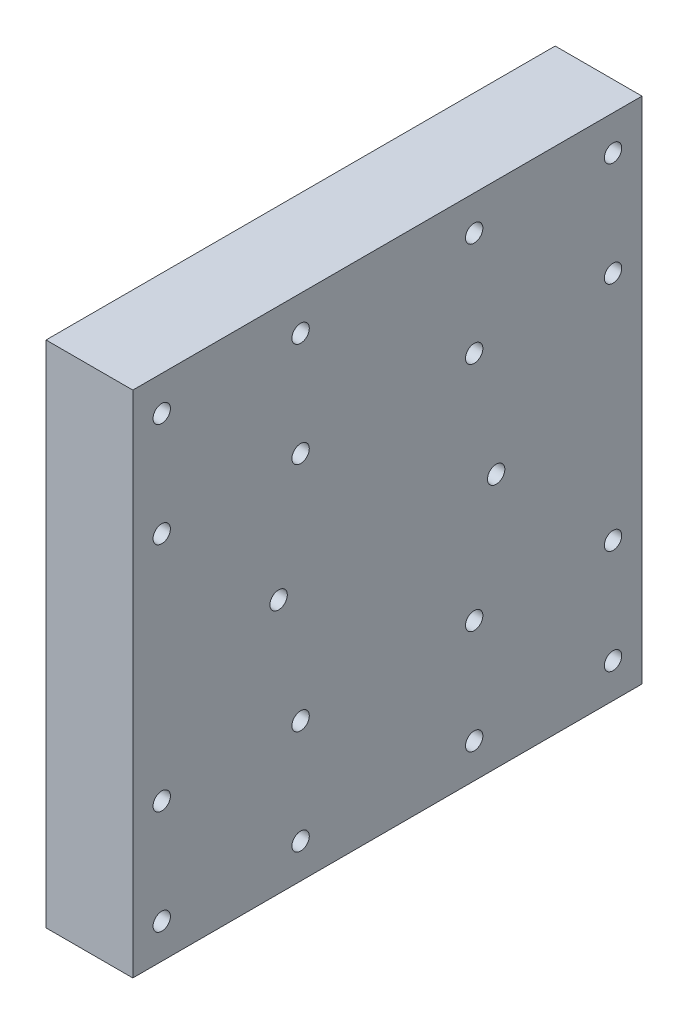
ISO-10303-21;
HEADER;
FILE_DESCRIPTION(('STEP AP214'),'2;1');
FILE_NAME('part.step','',(''),(''),'','','');
FILE_SCHEMA(('AUTOMOTIVE_DESIGN { 1 0 10303 214 1 1 1 1 }'));
ENDSEC;
DATA;
#1=APPLICATION_CONTEXT('core data for automotive mechanical design processes');
#2=APPLICATION_PROTOCOL_DEFINITION('international standard','automotive_design',2000,#1);
#3=PRODUCT_CONTEXT('',#1,'mechanical');
#4=PRODUCT('Part','Part','',(#3));
#5=PRODUCT_RELATED_PRODUCT_CATEGORY('part','',(#4));
#6=PRODUCT_DEFINITION_FORMATION('','',#4);
#7=PRODUCT_DEFINITION_CONTEXT('part definition',#1,'design');
#8=PRODUCT_DEFINITION('design','',#6,#7);
#9=PRODUCT_DEFINITION_SHAPE('','',#8);
#10=(LENGTH_UNIT() NAMED_UNIT(*) SI_UNIT(.MILLI.,.METRE.));
#11=(NAMED_UNIT(*) PLANE_ANGLE_UNIT() SI_UNIT($,.RADIAN.));
#12=(NAMED_UNIT(*) SI_UNIT($,.STERADIAN.) SOLID_ANGLE_UNIT());
#13=UNCERTAINTY_MEASURE_WITH_UNIT(LENGTH_MEASURE(1.E-05),#10,'distance_accuracy_value','');
#14=(GEOMETRIC_REPRESENTATION_CONTEXT(3) GLOBAL_UNCERTAINTY_ASSIGNED_CONTEXT((#13)) GLOBAL_UNIT_ASSIGNED_CONTEXT((#10,
#11,#12)) REPRESENTATION_CONTEXT('',''));
#15=CARTESIAN_POINT('',(0.,0.,0.));
#16=DIRECTION('',(0.,0.,1.));
#17=DIRECTION('',(1.,0.,0.));
#18=AXIS2_PLACEMENT_3D('',#15,#16,#17);
#19=CARTESIAN_POINT('',(15.,0.,0.));
#20=DIRECTION('',(-1.,0.,0.));
#21=DIRECTION('',(0.,0.,1.));
#22=AXIS2_PLACEMENT_3D('',#19,#20,#21);
#23=PLANE('',#22);
#24=CARTESIAN_POINT('',(15.,44.,-25.2));
#25=DIRECTION('',(1.,0.,0.));
#26=DIRECTION('',(0.,0.,-1.));
#27=AXIS2_PLACEMENT_3D('',#24,#25,#26);
#28=CIRCLE('',#27,1.5);
#29=CARTESIAN_POINT('',(15.,44.,-26.7));
#30=VERTEX_POINT('',#29);
#31=EDGE_CURVE('E205',#30,#30,#28,.T.);
#32=ORIENTED_EDGE('',*,*,#31,.F.);
#33=EDGE_LOOP('',(#32));
#34=FACE_BOUND('',#33,.T.);
#35=CARTESIAN_POINT('',(15.,6.00000000000001,-29.));
#36=DIRECTION('',(1.,0.,0.));
#37=DIRECTION('',(0.,0.,1.));
#38=AXIS2_PLACEMENT_3D('',#35,#36,#37);
#39=CIRCLE('',#38,1.5);
#40=CARTESIAN_POINT('',(15.,6.00000000000001,-27.5));
#41=VERTEX_POINT('',#40);
#42=EDGE_CURVE('E193',#41,#41,#39,.T.);
#43=ORIENTED_EDGE('',*,*,#42,.F.);
#44=EDGE_LOOP('',(#43));
#45=FACE_BOUND('',#44,.T.);
#46=CARTESIAN_POINT('',(15.,24.,-29.));
#47=DIRECTION('',(1.,0.,0.));
#48=DIRECTION('',(0.,0.,1.));
#49=AXIS2_PLACEMENT_3D('',#46,#47,#48);
#50=CIRCLE('',#49,1.5);
#51=CARTESIAN_POINT('',(15.,24.,-27.5));
#52=VERTEX_POINT('',#51);
#53=EDGE_CURVE('E181',#52,#52,#50,.T.);
#54=ORIENTED_EDGE('',*,*,#53,.F.);
#55=EDGE_LOOP('',(#54));
#56=FACE_BOUND('',#55,.T.);
#57=CARTESIAN_POINT('',(15.,6.00000000000001,-83.));
#58=DIRECTION('',(1.,0.,0.));
#59=DIRECTION('',(0.,0.,-1.));
#60=AXIS2_PLACEMENT_3D('',#57,#58,#59);
#61=CIRCLE('',#60,1.50000000000001);
#62=CARTESIAN_POINT('',(15.,6.00000000000001,-84.5));
#63=VERTEX_POINT('',#62);
#64=EDGE_CURVE('E169',#63,#63,#61,.T.);
#65=ORIENTED_EDGE('',*,*,#64,.F.);
#66=EDGE_LOOP('',(#65));
#67=FACE_BOUND('',#66,.T.);
#68=CARTESIAN_POINT('',(15.,24.,-83.));
#69=DIRECTION('',(1.,0.,0.));
#70=DIRECTION('',(0.,0.,-1.));
#71=AXIS2_PLACEMENT_3D('',#68,#69,#70);
#72=CIRCLE('',#71,1.50000000000001);
#73=CARTESIAN_POINT('',(15.,24.,-84.5));
#74=VERTEX_POINT('',#73);
#75=EDGE_CURVE('E157',#74,#74,#72,.T.);
#76=ORIENTED_EDGE('',*,*,#75,.F.);
#77=EDGE_LOOP('',(#76));
#78=FACE_BOUND('',#77,.T.);
#79=CARTESIAN_POINT('',(15.,64.,-83.));
#80=DIRECTION('',(1.,0.,0.));
#81=DIRECTION('',(0.,0.,1.));
#82=AXIS2_PLACEMENT_3D('',#79,#80,#81);
#83=CIRCLE('',#82,1.50000000000001);
#84=CARTESIAN_POINT('',(15.,64.,-81.5));
#85=VERTEX_POINT('',#84);
#86=EDGE_CURVE('E145',#85,#85,#83,.T.);
#87=ORIENTED_EDGE('',*,*,#86,.F.);
#88=EDGE_LOOP('',(#87));
#89=FACE_BOUND('',#88,.T.);
#90=CARTESIAN_POINT('',(15.,64.,-59.));
#91=DIRECTION('',(1.,0.,0.));
#92=DIRECTION('',(0.,0.,1.));
#93=AXIS2_PLACEMENT_3D('',#90,#91,#92);
#94=CIRCLE('',#93,1.5);
#95=CARTESIAN_POINT('',(15.,64.,-57.5));
#96=VERTEX_POINT('',#95);
#97=EDGE_CURVE('E133',#96,#96,#94,.T.);
#98=ORIENTED_EDGE('',*,*,#97,.F.);
#99=EDGE_LOOP('',(#98));
#100=FACE_BOUND('',#99,.T.);
#101=CARTESIAN_POINT('',(15.,64.,-29.));
#102=DIRECTION('',(1.,0.,0.));
#103=DIRECTION('',(0.,0.,-1.));
#104=AXIS2_PLACEMENT_3D('',#101,#102,#103);
#105=CIRCLE('',#104,1.5);
#106=CARTESIAN_POINT('',(15.,64.,-30.5));
#107=VERTEX_POINT('',#106);
#108=EDGE_CURVE('E121',#107,#107,#105,.T.);
#109=ORIENTED_EDGE('',*,*,#108,.F.);
#110=EDGE_LOOP('',(#109));
#111=FACE_BOUND('',#110,.T.);
#112=CARTESIAN_POINT('',(15.,82.,-5.));
#113=DIRECTION('',(1.,0.,0.));
#114=DIRECTION('',(0.,0.,-1.));
#115=AXIS2_PLACEMENT_3D('',#112,#113,#114);
#116=CIRCLE('',#115,1.5);
#117=CARTESIAN_POINT('',(15.,82.,-6.5));
#118=VERTEX_POINT('',#117);
#119=EDGE_CURVE('E100',#118,#118,#116,.T.);
#120=ORIENTED_EDGE('',*,*,#119,.F.);
#121=EDGE_LOOP('',(#120));
#122=FACE_BOUND('',#121,.T.);
#123=DIRECTION('',(0.,-1.,0.));
#124=VECTOR('',#123,1.);
#125=CARTESIAN_POINT('',(15.,0.,0.));
#126=LINE('',#125,#124);
#127=CARTESIAN_POINT('',(15.,88.,0.));
#128=VERTEX_POINT('',#127);
#129=CARTESIAN_POINT('',(15.,0.,0.));
#130=VERTEX_POINT('',#129);
#131=EDGE_CURVE('E85',#128,#130,#126,.T.);
#132=ORIENTED_EDGE('',*,*,#131,.T.);
#133=DIRECTION('',(0.,0.,-1.));
#134=VECTOR('',#133,1.);
#135=CARTESIAN_POINT('',(15.,0.,0.));
#136=LINE('',#135,#134);
#137=CARTESIAN_POINT('',(15.,0.,-88.));
#138=VERTEX_POINT('',#137);
#139=EDGE_CURVE('E80',#130,#138,#136,.T.);
#140=ORIENTED_EDGE('',*,*,#139,.T.);
#141=DIRECTION('',(0.,1.,0.));
#142=VECTOR('',#141,1.);
#143=CARTESIAN_POINT('',(15.,0.,-88.));
#144=LINE('',#143,#142);
#145=CARTESIAN_POINT('',(15.,88.,-88.));
#146=VERTEX_POINT('',#145);
#147=EDGE_CURVE('E83',#138,#146,#144,.T.);
#148=ORIENTED_EDGE('',*,*,#147,.T.);
#149=DIRECTION('',(0.,0.,1.));
#150=VECTOR('',#149,1.);
#151=CARTESIAN_POINT('',(15.,88.,0.));
#152=LINE('',#151,#150);
#153=EDGE_CURVE('E50',#146,#128,#152,.T.);
#154=ORIENTED_EDGE('',*,*,#153,.T.);
#155=EDGE_LOOP('',(#132,#140,#148,#154));
#156=FACE_BOUND('',#155,.T.);
#157=CARTESIAN_POINT('',(15.,82.,-29.));
#158=DIRECTION('',(1.,0.,0.));
#159=DIRECTION('',(0.,0.,-1.));
#160=AXIS2_PLACEMENT_3D('',#157,#158,#159);
#161=CIRCLE('',#160,1.5);
#162=CARTESIAN_POINT('',(15.,82.,-30.5));
#163=VERTEX_POINT('',#162);
#164=EDGE_CURVE('E115',#163,#163,#161,.T.);
#165=ORIENTED_EDGE('',*,*,#164,.F.);
#166=EDGE_LOOP('',(#165));
#167=FACE_BOUND('',#166,.T.);
#168=CARTESIAN_POINT('',(15.,64.,-5.));
#169=DIRECTION('',(1.,0.,0.));
#170=DIRECTION('',(0.,0.,-1.));
#171=AXIS2_PLACEMENT_3D('',#168,#169,#170);
#172=CIRCLE('',#171,1.5);
#173=CARTESIAN_POINT('',(15.,64.,-6.5));
#174=VERTEX_POINT('',#173);
#175=EDGE_CURVE('E127',#174,#174,#172,.T.);
#176=ORIENTED_EDGE('',*,*,#175,.F.);
#177=EDGE_LOOP('',(#176));
#178=FACE_BOUND('',#177,.T.);
#179=CARTESIAN_POINT('',(15.,82.,-59.));
#180=DIRECTION('',(1.,0.,0.));
#181=DIRECTION('',(0.,0.,1.));
#182=AXIS2_PLACEMENT_3D('',#179,#180,#181);
#183=CIRCLE('',#182,1.5);
#184=CARTESIAN_POINT('',(15.,82.,-57.5));
#185=VERTEX_POINT('',#184);
#186=EDGE_CURVE('E139',#185,#185,#183,.T.);
#187=ORIENTED_EDGE('',*,*,#186,.F.);
#188=EDGE_LOOP('',(#187));
#189=FACE_BOUND('',#188,.T.);
#190=CARTESIAN_POINT('',(15.,82.,-83.));
#191=DIRECTION('',(1.,0.,0.));
#192=DIRECTION('',(0.,0.,1.));
#193=AXIS2_PLACEMENT_3D('',#190,#191,#192);
#194=CIRCLE('',#193,1.50000000000001);
#195=CARTESIAN_POINT('',(15.,82.,-81.5));
#196=VERTEX_POINT('',#195);
#197=EDGE_CURVE('E151',#196,#196,#194,.T.);
#198=ORIENTED_EDGE('',*,*,#197,.F.);
#199=EDGE_LOOP('',(#198));
#200=FACE_BOUND('',#199,.T.);
#201=CARTESIAN_POINT('',(15.,24.,-59.));
#202=DIRECTION('',(1.,0.,0.));
#203=DIRECTION('',(0.,0.,-1.));
#204=AXIS2_PLACEMENT_3D('',#201,#202,#203);
#205=CIRCLE('',#204,1.5);
#206=CARTESIAN_POINT('',(15.,24.,-60.5));
#207=VERTEX_POINT('',#206);
#208=EDGE_CURVE('E163',#207,#207,#205,.T.);
#209=ORIENTED_EDGE('',*,*,#208,.F.);
#210=EDGE_LOOP('',(#209));
#211=FACE_BOUND('',#210,.T.);
#212=CARTESIAN_POINT('',(15.,6.00000000000001,-59.));
#213=DIRECTION('',(1.,0.,0.));
#214=DIRECTION('',(0.,0.,-1.));
#215=AXIS2_PLACEMENT_3D('',#212,#213,#214);
#216=CIRCLE('',#215,1.5);
#217=CARTESIAN_POINT('',(15.,6.00000000000001,-60.5));
#218=VERTEX_POINT('',#217);
#219=EDGE_CURVE('E175',#218,#218,#216,.T.);
#220=ORIENTED_EDGE('',*,*,#219,.F.);
#221=EDGE_LOOP('',(#220));
#222=FACE_BOUND('',#221,.T.);
#223=CARTESIAN_POINT('',(15.,24.,-5.));
#224=DIRECTION('',(1.,0.,0.));
#225=DIRECTION('',(0.,0.,1.));
#226=AXIS2_PLACEMENT_3D('',#223,#224,#225);
#227=CIRCLE('',#226,1.5);
#228=CARTESIAN_POINT('',(15.,24.,-3.5));
#229=VERTEX_POINT('',#228);
#230=EDGE_CURVE('E187',#229,#229,#227,.T.);
#231=ORIENTED_EDGE('',*,*,#230,.F.);
#232=EDGE_LOOP('',(#231));
#233=FACE_BOUND('',#232,.T.);
#234=CARTESIAN_POINT('',(15.,6.00000000000001,-5.));
#235=DIRECTION('',(1.,0.,0.));
#236=DIRECTION('',(0.,0.,1.));
#237=AXIS2_PLACEMENT_3D('',#234,#235,#236);
#238=CIRCLE('',#237,1.5);
#239=CARTESIAN_POINT('',(15.,6.00000000000001,-3.5));
#240=VERTEX_POINT('',#239);
#241=EDGE_CURVE('E199',#240,#240,#238,.T.);
#242=ORIENTED_EDGE('',*,*,#241,.F.);
#243=EDGE_LOOP('',(#242));
#244=FACE_BOUND('',#243,.T.);
#245=CARTESIAN_POINT('',(15.,44.,-62.8));
#246=DIRECTION('',(1.,0.,0.));
#247=DIRECTION('',(0.,0.,-1.));
#248=AXIS2_PLACEMENT_3D('',#245,#246,#247);
#249=CIRCLE('',#248,1.5);
#250=CARTESIAN_POINT('',(15.,44.,-64.3));
#251=VERTEX_POINT('',#250);
#252=EDGE_CURVE('E211',#251,#251,#249,.T.);
#253=ORIENTED_EDGE('',*,*,#252,.F.);
#254=EDGE_LOOP('',(#253));
#255=FACE_BOUND('',#254,.T.);
#256=ADVANCED_FACE('F33',(#34,#45,#56,#67,#78,#89,#100,#111,#122,#156,#167,#178,#189,#200,#211,
#222,#233,#244,#255),#23,.F.);
#257=CARTESIAN_POINT('',(0.,0.,0.));
#258=DIRECTION('',(-1.,0.,0.));
#259=DIRECTION('',(0.,0.,1.));
#260=AXIS2_PLACEMENT_3D('',#257,#258,#259);
#261=PLANE('',#260);
#262=CARTESIAN_POINT('',(0.,44.,-25.2));
#263=DIRECTION('',(1.,0.,0.));
#264=DIRECTION('',(0.,0.,-1.));
#265=AXIS2_PLACEMENT_3D('',#262,#263,#264);
#266=CIRCLE('',#265,1.5);
#267=CARTESIAN_POINT('',(0.,44.,-26.7));
#268=VERTEX_POINT('',#267);
#269=EDGE_CURVE('E208',#268,#268,#266,.T.);
#270=ORIENTED_EDGE('',*,*,#269,.T.);
#271=EDGE_LOOP('',(#270));
#272=FACE_BOUND('',#271,.T.);
#273=CARTESIAN_POINT('',(0.,6.00000000000001,-29.));
#274=DIRECTION('',(1.,0.,0.));
#275=DIRECTION('',(0.,0.,1.));
#276=AXIS2_PLACEMENT_3D('',#273,#274,#275);
#277=CIRCLE('',#276,1.5);
#278=CARTESIAN_POINT('',(0.,6.00000000000001,-27.5));
#279=VERTEX_POINT('',#278);
#280=EDGE_CURVE('E196',#279,#279,#277,.T.);
#281=ORIENTED_EDGE('',*,*,#280,.T.);
#282=EDGE_LOOP('',(#281));
#283=FACE_BOUND('',#282,.T.);
#284=CARTESIAN_POINT('',(0.,24.,-29.));
#285=DIRECTION('',(1.,0.,0.));
#286=DIRECTION('',(0.,0.,1.));
#287=AXIS2_PLACEMENT_3D('',#284,#285,#286);
#288=CIRCLE('',#287,1.5);
#289=CARTESIAN_POINT('',(0.,24.,-27.5));
#290=VERTEX_POINT('',#289);
#291=EDGE_CURVE('E184',#290,#290,#288,.T.);
#292=ORIENTED_EDGE('',*,*,#291,.T.);
#293=EDGE_LOOP('',(#292));
#294=FACE_BOUND('',#293,.T.);
#295=CARTESIAN_POINT('',(0.,6.00000000000001,-83.));
#296=DIRECTION('',(1.,0.,0.));
#297=DIRECTION('',(0.,0.,-1.));
#298=AXIS2_PLACEMENT_3D('',#295,#296,#297);
#299=CIRCLE('',#298,1.50000000000001);
#300=CARTESIAN_POINT('',(0.,6.00000000000001,-84.5));
#301=VERTEX_POINT('',#300);
#302=EDGE_CURVE('E172',#301,#301,#299,.T.);
#303=ORIENTED_EDGE('',*,*,#302,.T.);
#304=EDGE_LOOP('',(#303));
#305=FACE_BOUND('',#304,.T.);
#306=CARTESIAN_POINT('',(0.,24.,-83.));
#307=DIRECTION('',(1.,0.,0.));
#308=DIRECTION('',(0.,0.,-1.));
#309=AXIS2_PLACEMENT_3D('',#306,#307,#308);
#310=CIRCLE('',#309,1.50000000000001);
#311=CARTESIAN_POINT('',(0.,24.,-84.5));
#312=VERTEX_POINT('',#311);
#313=EDGE_CURVE('E160',#312,#312,#310,.T.);
#314=ORIENTED_EDGE('',*,*,#313,.T.);
#315=EDGE_LOOP('',(#314));
#316=FACE_BOUND('',#315,.T.);
#317=CARTESIAN_POINT('',(0.,64.,-83.));
#318=DIRECTION('',(1.,0.,0.));
#319=DIRECTION('',(0.,0.,1.));
#320=AXIS2_PLACEMENT_3D('',#317,#318,#319);
#321=CIRCLE('',#320,1.50000000000001);
#322=CARTESIAN_POINT('',(0.,64.,-81.5));
#323=VERTEX_POINT('',#322);
#324=EDGE_CURVE('E148',#323,#323,#321,.T.);
#325=ORIENTED_EDGE('',*,*,#324,.T.);
#326=EDGE_LOOP('',(#325));
#327=FACE_BOUND('',#326,.T.);
#328=CARTESIAN_POINT('',(0.,64.,-59.));
#329=DIRECTION('',(1.,0.,0.));
#330=DIRECTION('',(0.,0.,1.));
#331=AXIS2_PLACEMENT_3D('',#328,#329,#330);
#332=CIRCLE('',#331,1.5);
#333=CARTESIAN_POINT('',(0.,64.,-57.5));
#334=VERTEX_POINT('',#333);
#335=EDGE_CURVE('E136',#334,#334,#332,.T.);
#336=ORIENTED_EDGE('',*,*,#335,.T.);
#337=EDGE_LOOP('',(#336));
#338=FACE_BOUND('',#337,.T.);
#339=CARTESIAN_POINT('',(0.,64.,-29.));
#340=DIRECTION('',(1.,0.,0.));
#341=DIRECTION('',(0.,0.,-1.));
#342=AXIS2_PLACEMENT_3D('',#339,#340,#341);
#343=CIRCLE('',#342,1.5);
#344=CARTESIAN_POINT('',(0.,64.,-30.5));
#345=VERTEX_POINT('',#344);
#346=EDGE_CURVE('E124',#345,#345,#343,.T.);
#347=ORIENTED_EDGE('',*,*,#346,.T.);
#348=EDGE_LOOP('',(#347));
#349=FACE_BOUND('',#348,.T.);
#350=CARTESIAN_POINT('',(0.,82.,-5.));
#351=DIRECTION('',(1.,0.,0.));
#352=DIRECTION('',(0.,0.,-1.));
#353=AXIS2_PLACEMENT_3D('',#350,#351,#352);
#354=CIRCLE('',#353,1.5);
#355=CARTESIAN_POINT('',(0.,82.,-6.5));
#356=VERTEX_POINT('',#355);
#357=EDGE_CURVE('E112',#356,#356,#354,.T.);
#358=ORIENTED_EDGE('',*,*,#357,.T.);
#359=EDGE_LOOP('',(#358));
#360=FACE_BOUND('',#359,.T.);
#361=DIRECTION('',(0.,-1.,0.));
#362=VECTOR('',#361,1.);
#363=CARTESIAN_POINT('',(0.,0.,0.));
#364=LINE('',#363,#362);
#365=CARTESIAN_POINT('',(0.,88.,0.));
#366=VERTEX_POINT('',#365);
#367=CARTESIAN_POINT('',(0.,0.,0.));
#368=VERTEX_POINT('',#367);
#369=EDGE_CURVE('E97',#366,#368,#364,.T.);
#370=ORIENTED_EDGE('',*,*,#369,.F.);
#371=DIRECTION('',(0.,0.,1.));
#372=VECTOR('',#371,1.);
#373=CARTESIAN_POINT('',(0.,88.,0.));
#374=LINE('',#373,#372);
#375=CARTESIAN_POINT('',(0.,88.,-88.));
#376=VERTEX_POINT('',#375);
#377=EDGE_CURVE('E73',#376,#366,#374,.T.);
#378=ORIENTED_EDGE('',*,*,#377,.F.);
#379=DIRECTION('',(0.,1.,0.));
#380=VECTOR('',#379,1.);
#381=CARTESIAN_POINT('',(0.,0.,-88.));
#382=LINE('',#381,#380);
#383=CARTESIAN_POINT('',(0.,0.,-88.));
#384=VERTEX_POINT('',#383);
#385=EDGE_CURVE('E67',#384,#376,#382,.T.);
#386=ORIENTED_EDGE('',*,*,#385,.F.);
#387=DIRECTION('',(0.,0.,-1.));
#388=VECTOR('',#387,1.);
#389=CARTESIAN_POINT('',(0.,0.,0.));
#390=LINE('',#389,#388);
#391=EDGE_CURVE('E89',#368,#384,#390,.T.);
#392=ORIENTED_EDGE('',*,*,#391,.F.);
#393=EDGE_LOOP('',(#370,#378,#386,#392));
#394=FACE_BOUND('',#393,.T.);
#395=CARTESIAN_POINT('',(0.,82.,-29.));
#396=DIRECTION('',(1.,0.,0.));
#397=DIRECTION('',(0.,0.,-1.));
#398=AXIS2_PLACEMENT_3D('',#395,#396,#397);
#399=CIRCLE('',#398,1.5);
#400=CARTESIAN_POINT('',(0.,82.,-30.5));
#401=VERTEX_POINT('',#400);
#402=EDGE_CURVE('E118',#401,#401,#399,.T.);
#403=ORIENTED_EDGE('',*,*,#402,.T.);
#404=EDGE_LOOP('',(#403));
#405=FACE_BOUND('',#404,.T.);
#406=CARTESIAN_POINT('',(0.,64.,-5.));
#407=DIRECTION('',(1.,0.,0.));
#408=DIRECTION('',(0.,0.,-1.));
#409=AXIS2_PLACEMENT_3D('',#406,#407,#408);
#410=CIRCLE('',#409,1.5);
#411=CARTESIAN_POINT('',(0.,64.,-6.5));
#412=VERTEX_POINT('',#411);
#413=EDGE_CURVE('E130',#412,#412,#410,.T.);
#414=ORIENTED_EDGE('',*,*,#413,.T.);
#415=EDGE_LOOP('',(#414));
#416=FACE_BOUND('',#415,.T.);
#417=CARTESIAN_POINT('',(0.,82.,-59.));
#418=DIRECTION('',(1.,0.,0.));
#419=DIRECTION('',(0.,0.,1.));
#420=AXIS2_PLACEMENT_3D('',#417,#418,#419);
#421=CIRCLE('',#420,1.5);
#422=CARTESIAN_POINT('',(0.,82.,-57.5));
#423=VERTEX_POINT('',#422);
#424=EDGE_CURVE('E142',#423,#423,#421,.T.);
#425=ORIENTED_EDGE('',*,*,#424,.T.);
#426=EDGE_LOOP('',(#425));
#427=FACE_BOUND('',#426,.T.);
#428=CARTESIAN_POINT('',(0.,82.,-83.));
#429=DIRECTION('',(1.,0.,0.));
#430=DIRECTION('',(0.,0.,1.));
#431=AXIS2_PLACEMENT_3D('',#428,#429,#430);
#432=CIRCLE('',#431,1.50000000000001);
#433=CARTESIAN_POINT('',(0.,82.,-81.5));
#434=VERTEX_POINT('',#433);
#435=EDGE_CURVE('E154',#434,#434,#432,.T.);
#436=ORIENTED_EDGE('',*,*,#435,.T.);
#437=EDGE_LOOP('',(#436));
#438=FACE_BOUND('',#437,.T.);
#439=CARTESIAN_POINT('',(0.,24.,-59.));
#440=DIRECTION('',(1.,0.,0.));
#441=DIRECTION('',(0.,0.,-1.));
#442=AXIS2_PLACEMENT_3D('',#439,#440,#441);
#443=CIRCLE('',#442,1.5);
#444=CARTESIAN_POINT('',(0.,24.,-60.5));
#445=VERTEX_POINT('',#444);
#446=EDGE_CURVE('E166',#445,#445,#443,.T.);
#447=ORIENTED_EDGE('',*,*,#446,.T.);
#448=EDGE_LOOP('',(#447));
#449=FACE_BOUND('',#448,.T.);
#450=CARTESIAN_POINT('',(0.,6.00000000000001,-59.));
#451=DIRECTION('',(1.,0.,0.));
#452=DIRECTION('',(0.,0.,-1.));
#453=AXIS2_PLACEMENT_3D('',#450,#451,#452);
#454=CIRCLE('',#453,1.5);
#455=CARTESIAN_POINT('',(0.,6.00000000000001,-60.5));
#456=VERTEX_POINT('',#455);
#457=EDGE_CURVE('E178',#456,#456,#454,.T.);
#458=ORIENTED_EDGE('',*,*,#457,.T.);
#459=EDGE_LOOP('',(#458));
#460=FACE_BOUND('',#459,.T.);
#461=CARTESIAN_POINT('',(0.,24.,-5.));
#462=DIRECTION('',(1.,0.,0.));
#463=DIRECTION('',(0.,0.,1.));
#464=AXIS2_PLACEMENT_3D('',#461,#462,#463);
#465=CIRCLE('',#464,1.5);
#466=CARTESIAN_POINT('',(0.,24.,-3.5));
#467=VERTEX_POINT('',#466);
#468=EDGE_CURVE('E190',#467,#467,#465,.T.);
#469=ORIENTED_EDGE('',*,*,#468,.T.);
#470=EDGE_LOOP('',(#469));
#471=FACE_BOUND('',#470,.T.);
#472=CARTESIAN_POINT('',(0.,6.00000000000001,-5.));
#473=DIRECTION('',(1.,0.,0.));
#474=DIRECTION('',(0.,0.,1.));
#475=AXIS2_PLACEMENT_3D('',#472,#473,#474);
#476=CIRCLE('',#475,1.5);
#477=CARTESIAN_POINT('',(0.,6.00000000000001,-3.5));
#478=VERTEX_POINT('',#477);
#479=EDGE_CURVE('E202',#478,#478,#476,.T.);
#480=ORIENTED_EDGE('',*,*,#479,.T.);
#481=EDGE_LOOP('',(#480));
#482=FACE_BOUND('',#481,.T.);
#483=CARTESIAN_POINT('',(0.,44.,-62.8));
#484=DIRECTION('',(1.,0.,0.));
#485=DIRECTION('',(0.,0.,-1.));
#486=AXIS2_PLACEMENT_3D('',#483,#484,#485);
#487=CIRCLE('',#486,1.5);
#488=CARTESIAN_POINT('',(0.,44.,-64.3));
#489=VERTEX_POINT('',#488);
#490=EDGE_CURVE('E214',#489,#489,#487,.T.);
#491=ORIENTED_EDGE('',*,*,#490,.T.);
#492=EDGE_LOOP('',(#491));
#493=FACE_BOUND('',#492,.T.);
#494=ADVANCED_FACE('F108',(#272,#283,#294,#305,#316,#327,#338,#349,#360,#394,#405,#416,#427,
#438,#449,#460,#471,#482,#493),#261,.T.);
#495=CARTESIAN_POINT('',(15.,0.,0.));
#496=DIRECTION('',(0.,0.,-1.));
#497=DIRECTION('',(-1.,0.,0.));
#498=AXIS2_PLACEMENT_3D('',#495,#496,#497);
#499=PLANE('',#498);
#500=ORIENTED_EDGE('',*,*,#369,.T.);
#501=DIRECTION('',(-1.,0.,0.));
#502=VECTOR('',#501,1.);
#503=CARTESIAN_POINT('',(15.,0.,0.));
#504=LINE('',#503,#502);
#505=EDGE_CURVE('E11',#130,#368,#504,.T.);
#506=ORIENTED_EDGE('',*,*,#505,.F.);
#507=ORIENTED_EDGE('',*,*,#131,.F.);
#508=DIRECTION('',(-1.,0.,0.));
#509=VECTOR('',#508,1.);
#510=CARTESIAN_POINT('',(15.,88.,0.));
#511=LINE('',#510,#509);
#512=EDGE_CURVE('E93',#128,#366,#511,.T.);
#513=ORIENTED_EDGE('',*,*,#512,.T.);
#514=EDGE_LOOP('',(#500,#506,#507,#513));
#515=FACE_BOUND('',#514,.T.);
#516=ADVANCED_FACE('F35',(#515),#499,.F.);
#517=CARTESIAN_POINT('',(15.,0.,0.));
#518=DIRECTION('',(0.,1.,0.));
#519=DIRECTION('',(0.,0.,1.));
#520=AXIS2_PLACEMENT_3D('',#517,#518,#519);
#521=PLANE('',#520);
#522=ORIENTED_EDGE('',*,*,#391,.T.);
#523=DIRECTION('',(-1.,0.,0.));
#524=VECTOR('',#523,1.);
#525=CARTESIAN_POINT('',(15.,0.,-88.));
#526=LINE('',#525,#524);
#527=EDGE_CURVE('E42',#138,#384,#526,.T.);
#528=ORIENTED_EDGE('',*,*,#527,.F.);
#529=ORIENTED_EDGE('',*,*,#139,.F.);
#530=ORIENTED_EDGE('',*,*,#505,.T.);
#531=EDGE_LOOP('',(#522,#528,#529,#530));
#532=FACE_BOUND('',#531,.T.);
#533=ADVANCED_FACE('F88',(#532),#521,.F.);
#534=CARTESIAN_POINT('',(15.,0.,-88.));
#535=DIRECTION('',(0.,0.,1.));
#536=DIRECTION('',(1.,0.,0.));
#537=AXIS2_PLACEMENT_3D('',#534,#535,#536);
#538=PLANE('',#537);
#539=ORIENTED_EDGE('',*,*,#385,.T.);
#540=DIRECTION('',(-1.,0.,0.));
#541=VECTOR('',#540,1.);
#542=CARTESIAN_POINT('',(15.,88.,-88.));
#543=LINE('',#542,#541);
#544=EDGE_CURVE('E90',#146,#376,#543,.T.);
#545=ORIENTED_EDGE('',*,*,#544,.F.);
#546=ORIENTED_EDGE('',*,*,#147,.F.);
#547=ORIENTED_EDGE('',*,*,#527,.T.);
#548=EDGE_LOOP('',(#539,#545,#546,#547));
#549=FACE_BOUND('',#548,.T.);
#550=ADVANCED_FACE('F91',(#549),#538,.F.);
#551=CARTESIAN_POINT('',(15.,88.,0.));
#552=DIRECTION('',(0.,-1.,0.));
#553=DIRECTION('',(0.,0.,-1.));
#554=AXIS2_PLACEMENT_3D('',#551,#552,#553);
#555=PLANE('',#554);
#556=ORIENTED_EDGE('',*,*,#377,.T.);
#557=ORIENTED_EDGE('',*,*,#512,.F.);
#558=ORIENTED_EDGE('',*,*,#153,.F.);
#559=ORIENTED_EDGE('',*,*,#544,.T.);
#560=EDGE_LOOP('',(#556,#557,#558,#559));
#561=FACE_BOUND('',#560,.T.);
#562=ADVANCED_FACE('F105',(#561),#555,.F.);
#563=CARTESIAN_POINT('',(15.,82.,-5.));
#564=DIRECTION('',(-1.,0.,0.));
#565=DIRECTION('',(0.,0.,1.));
#566=AXIS2_PLACEMENT_3D('',#563,#564,#565);
#567=CYLINDRICAL_SURFACE('',#566,1.5);
#568=ORIENTED_EDGE('',*,*,#119,.T.);
#569=EDGE_LOOP('',(#568));
#570=FACE_BOUND('',#569,.T.);
#571=ORIENTED_EDGE('',*,*,#357,.F.);
#572=EDGE_LOOP('',(#571));
#573=FACE_BOUND('',#572,.T.);
#574=ADVANCED_FACE('F234',(#570,#573),#567,.F.);
#575=CARTESIAN_POINT('',(15.,82.,-29.));
#576=DIRECTION('',(-1.,0.,0.));
#577=DIRECTION('',(0.,0.,1.));
#578=AXIS2_PLACEMENT_3D('',#575,#576,#577);
#579=CYLINDRICAL_SURFACE('',#578,1.5);
#580=ORIENTED_EDGE('',*,*,#164,.T.);
#581=EDGE_LOOP('',(#580));
#582=FACE_BOUND('',#581,.T.);
#583=ORIENTED_EDGE('',*,*,#402,.F.);
#584=EDGE_LOOP('',(#583));
#585=FACE_BOUND('',#584,.T.);
#586=ADVANCED_FACE('F280',(#582,#585),#579,.F.);
#587=CARTESIAN_POINT('',(15.,64.,-29.));
#588=DIRECTION('',(-1.,0.,0.));
#589=DIRECTION('',(0.,0.,1.));
#590=AXIS2_PLACEMENT_3D('',#587,#588,#589);
#591=CYLINDRICAL_SURFACE('',#590,1.5);
#592=ORIENTED_EDGE('',*,*,#108,.T.);
#593=EDGE_LOOP('',(#592));
#594=FACE_BOUND('',#593,.T.);
#595=ORIENTED_EDGE('',*,*,#346,.F.);
#596=EDGE_LOOP('',(#595));
#597=FACE_BOUND('',#596,.T.);
#598=ADVANCED_FACE('F288',(#594,#597),#591,.F.);
#599=CARTESIAN_POINT('',(15.,64.,-5.));
#600=DIRECTION('',(-1.,0.,0.));
#601=DIRECTION('',(0.,0.,1.));
#602=AXIS2_PLACEMENT_3D('',#599,#600,#601);
#603=CYLINDRICAL_SURFACE('',#602,1.5);
#604=ORIENTED_EDGE('',*,*,#175,.T.);
#605=EDGE_LOOP('',(#604));
#606=FACE_BOUND('',#605,.T.);
#607=ORIENTED_EDGE('',*,*,#413,.F.);
#608=EDGE_LOOP('',(#607));
#609=FACE_BOUND('',#608,.T.);
#610=ADVANCED_FACE('F296',(#606,#609),#603,.F.);
#611=CARTESIAN_POINT('',(15.,64.,-59.));
#612=DIRECTION('',(-1.,0.,0.));
#613=DIRECTION('',(0.,0.,1.));
#614=AXIS2_PLACEMENT_3D('',#611,#612,#613);
#615=CYLINDRICAL_SURFACE('',#614,1.5);
#616=ORIENTED_EDGE('',*,*,#97,.T.);
#617=EDGE_LOOP('',(#616));
#618=FACE_BOUND('',#617,.T.);
#619=ORIENTED_EDGE('',*,*,#335,.F.);
#620=EDGE_LOOP('',(#619));
#621=FACE_BOUND('',#620,.T.);
#622=ADVANCED_FACE('F305',(#618,#621),#615,.F.);
#623=CARTESIAN_POINT('',(15.,82.,-59.));
#624=DIRECTION('',(-1.,0.,0.));
#625=DIRECTION('',(0.,0.,1.));
#626=AXIS2_PLACEMENT_3D('',#623,#624,#625);
#627=CYLINDRICAL_SURFACE('',#626,1.5);
#628=ORIENTED_EDGE('',*,*,#186,.T.);
#629=EDGE_LOOP('',(#628));
#630=FACE_BOUND('',#629,.T.);
#631=ORIENTED_EDGE('',*,*,#424,.F.);
#632=EDGE_LOOP('',(#631));
#633=FACE_BOUND('',#632,.T.);
#634=ADVANCED_FACE('F314',(#630,#633),#627,.F.);
#635=CARTESIAN_POINT('',(15.,64.,-83.));
#636=DIRECTION('',(-1.,0.,0.));
#637=DIRECTION('',(0.,0.,1.));
#638=AXIS2_PLACEMENT_3D('',#635,#636,#637);
#639=CYLINDRICAL_SURFACE('',#638,1.50000000000001);
#640=ORIENTED_EDGE('',*,*,#86,.T.);
#641=EDGE_LOOP('',(#640));
#642=FACE_BOUND('',#641,.T.);
#643=ORIENTED_EDGE('',*,*,#324,.F.);
#644=EDGE_LOOP('',(#643));
#645=FACE_BOUND('',#644,.T.);
#646=ADVANCED_FACE('F323',(#642,#645),#639,.F.);
#647=CARTESIAN_POINT('',(15.,82.,-83.));
#648=DIRECTION('',(-1.,0.,0.));
#649=DIRECTION('',(0.,0.,1.));
#650=AXIS2_PLACEMENT_3D('',#647,#648,#649);
#651=CYLINDRICAL_SURFACE('',#650,1.50000000000001);
#652=ORIENTED_EDGE('',*,*,#197,.T.);
#653=EDGE_LOOP('',(#652));
#654=FACE_BOUND('',#653,.T.);
#655=ORIENTED_EDGE('',*,*,#435,.F.);
#656=EDGE_LOOP('',(#655));
#657=FACE_BOUND('',#656,.T.);
#658=ADVANCED_FACE('F332',(#654,#657),#651,.F.);
#659=CARTESIAN_POINT('',(15.,24.,-83.));
#660=DIRECTION('',(-1.,0.,0.));
#661=DIRECTION('',(0.,0.,1.));
#662=AXIS2_PLACEMENT_3D('',#659,#660,#661);
#663=CYLINDRICAL_SURFACE('',#662,1.50000000000001);
#664=ORIENTED_EDGE('',*,*,#75,.T.);
#665=EDGE_LOOP('',(#664));
#666=FACE_BOUND('',#665,.T.);
#667=ORIENTED_EDGE('',*,*,#313,.F.);
#668=EDGE_LOOP('',(#667));
#669=FACE_BOUND('',#668,.T.);
#670=ADVANCED_FACE('F341',(#666,#669),#663,.F.);
#671=CARTESIAN_POINT('',(15.,24.,-59.));
#672=DIRECTION('',(-1.,0.,0.));
#673=DIRECTION('',(0.,0.,1.));
#674=AXIS2_PLACEMENT_3D('',#671,#672,#673);
#675=CYLINDRICAL_SURFACE('',#674,1.5);
#676=ORIENTED_EDGE('',*,*,#208,.T.);
#677=EDGE_LOOP('',(#676));
#678=FACE_BOUND('',#677,.T.);
#679=ORIENTED_EDGE('',*,*,#446,.F.);
#680=EDGE_LOOP('',(#679));
#681=FACE_BOUND('',#680,.T.);
#682=ADVANCED_FACE('F350',(#678,#681),#675,.F.);
#683=CARTESIAN_POINT('',(15.,6.00000000000001,-83.));
#684=DIRECTION('',(-1.,0.,0.));
#685=DIRECTION('',(0.,0.,1.));
#686=AXIS2_PLACEMENT_3D('',#683,#684,#685);
#687=CYLINDRICAL_SURFACE('',#686,1.50000000000001);
#688=ORIENTED_EDGE('',*,*,#64,.T.);
#689=EDGE_LOOP('',(#688));
#690=FACE_BOUND('',#689,.T.);
#691=ORIENTED_EDGE('',*,*,#302,.F.);
#692=EDGE_LOOP('',(#691));
#693=FACE_BOUND('',#692,.T.);
#694=ADVANCED_FACE('F359',(#690,#693),#687,.F.);
#695=CARTESIAN_POINT('',(15.,6.00000000000001,-59.));
#696=DIRECTION('',(-1.,0.,0.));
#697=DIRECTION('',(0.,0.,1.));
#698=AXIS2_PLACEMENT_3D('',#695,#696,#697);
#699=CYLINDRICAL_SURFACE('',#698,1.5);
#700=ORIENTED_EDGE('',*,*,#219,.T.);
#701=EDGE_LOOP('',(#700));
#702=FACE_BOUND('',#701,.T.);
#703=ORIENTED_EDGE('',*,*,#457,.F.);
#704=EDGE_LOOP('',(#703));
#705=FACE_BOUND('',#704,.T.);
#706=ADVANCED_FACE('F368',(#702,#705),#699,.F.);
#707=CARTESIAN_POINT('',(15.,24.,-29.));
#708=DIRECTION('',(-1.,0.,0.));
#709=DIRECTION('',(0.,0.,1.));
#710=AXIS2_PLACEMENT_3D('',#707,#708,#709);
#711=CYLINDRICAL_SURFACE('',#710,1.5);
#712=ORIENTED_EDGE('',*,*,#53,.T.);
#713=EDGE_LOOP('',(#712));
#714=FACE_BOUND('',#713,.T.);
#715=ORIENTED_EDGE('',*,*,#291,.F.);
#716=EDGE_LOOP('',(#715));
#717=FACE_BOUND('',#716,.T.);
#718=ADVANCED_FACE('F377',(#714,#717),#711,.F.);
#719=CARTESIAN_POINT('',(15.,24.,-5.));
#720=DIRECTION('',(-1.,0.,0.));
#721=DIRECTION('',(0.,0.,1.));
#722=AXIS2_PLACEMENT_3D('',#719,#720,#721);
#723=CYLINDRICAL_SURFACE('',#722,1.5);
#724=ORIENTED_EDGE('',*,*,#230,.T.);
#725=EDGE_LOOP('',(#724));
#726=FACE_BOUND('',#725,.T.);
#727=ORIENTED_EDGE('',*,*,#468,.F.);
#728=EDGE_LOOP('',(#727));
#729=FACE_BOUND('',#728,.T.);
#730=ADVANCED_FACE('F386',(#726,#729),#723,.F.);
#731=CARTESIAN_POINT('',(15.,6.00000000000001,-29.));
#732=DIRECTION('',(-1.,0.,0.));
#733=DIRECTION('',(0.,0.,1.));
#734=AXIS2_PLACEMENT_3D('',#731,#732,#733);
#735=CYLINDRICAL_SURFACE('',#734,1.5);
#736=ORIENTED_EDGE('',*,*,#42,.T.);
#737=EDGE_LOOP('',(#736));
#738=FACE_BOUND('',#737,.T.);
#739=ORIENTED_EDGE('',*,*,#280,.F.);
#740=EDGE_LOOP('',(#739));
#741=FACE_BOUND('',#740,.T.);
#742=ADVANCED_FACE('F395',(#738,#741),#735,.F.);
#743=CARTESIAN_POINT('',(15.,6.00000000000001,-5.));
#744=DIRECTION('',(-1.,0.,0.));
#745=DIRECTION('',(0.,0.,1.));
#746=AXIS2_PLACEMENT_3D('',#743,#744,#745);
#747=CYLINDRICAL_SURFACE('',#746,1.5);
#748=ORIENTED_EDGE('',*,*,#241,.T.);
#749=EDGE_LOOP('',(#748));
#750=FACE_BOUND('',#749,.T.);
#751=ORIENTED_EDGE('',*,*,#479,.F.);
#752=EDGE_LOOP('',(#751));
#753=FACE_BOUND('',#752,.T.);
#754=ADVANCED_FACE('F404',(#750,#753),#747,.F.);
#755=CARTESIAN_POINT('',(15.,44.,-25.2));
#756=DIRECTION('',(-1.,0.,0.));
#757=DIRECTION('',(0.,0.,1.));
#758=AXIS2_PLACEMENT_3D('',#755,#756,#757);
#759=CYLINDRICAL_SURFACE('',#758,1.5);
#760=ORIENTED_EDGE('',*,*,#31,.T.);
#761=EDGE_LOOP('',(#760));
#762=FACE_BOUND('',#761,.T.);
#763=ORIENTED_EDGE('',*,*,#269,.F.);
#764=EDGE_LOOP('',(#763));
#765=FACE_BOUND('',#764,.T.);
#766=ADVANCED_FACE('F413',(#762,#765),#759,.F.);
#767=CARTESIAN_POINT('',(15.,44.,-62.8));
#768=DIRECTION('',(-1.,0.,0.));
#769=DIRECTION('',(0.,0.,1.));
#770=AXIS2_PLACEMENT_3D('',#767,#768,#769);
#771=CYLINDRICAL_SURFACE('',#770,1.5);
#772=ORIENTED_EDGE('',*,*,#252,.T.);
#773=EDGE_LOOP('',(#772));
#774=FACE_BOUND('',#773,.T.);
#775=ORIENTED_EDGE('',*,*,#490,.F.);
#776=EDGE_LOOP('',(#775));
#777=FACE_BOUND('',#776,.T.);
#778=ADVANCED_FACE('F220',(#774,#777),#771,.F.);
#779=CLOSED_SHELL('',(#256,#494,#516,#533,#550,#562,#574,#586,#598,#610,#622,#634,#646,#658,
#670,#682,#694,#706,#718,#730,#742,#754,#766,#778));
#780=MANIFOLD_SOLID_BREP('B2',#779);
#781=ADVANCED_BREP_SHAPE_REPRESENTATION('',(#18,#780),#14);
#782=SHAPE_DEFINITION_REPRESENTATION(#9,#781);
ENDSEC;
END-ISO-10303-21;
